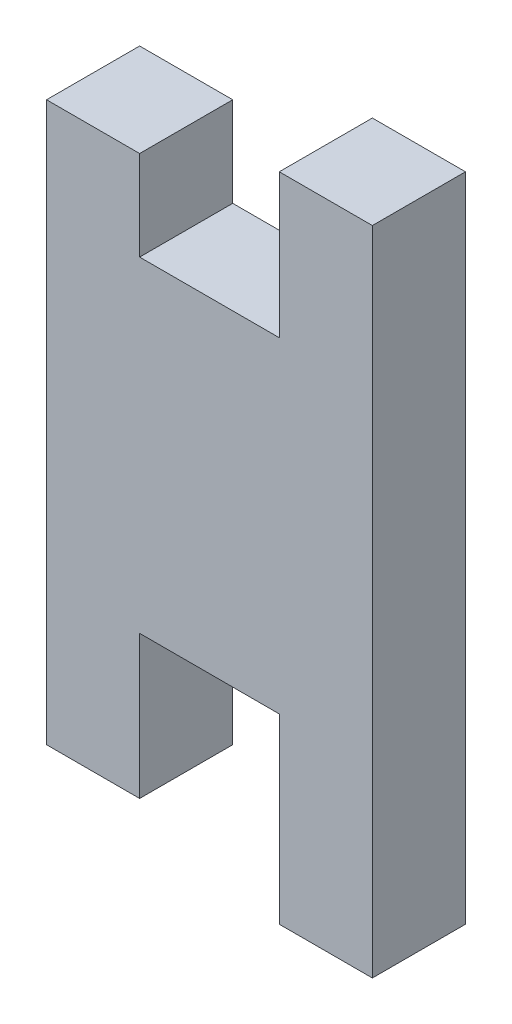
ISO-10303-21;
HEADER;
FILE_DESCRIPTION(('STEP AP214'),'2;1');
FILE_NAME('part.step','',(''),(''),'','','');
FILE_SCHEMA(('AUTOMOTIVE_DESIGN { 1 0 10303 214 1 1 1 1 }'));
ENDSEC;
DATA;
#1=APPLICATION_CONTEXT('core data for automotive mechanical design processes');
#2=APPLICATION_PROTOCOL_DEFINITION('international standard','automotive_design',2000,#1);
#3=PRODUCT_CONTEXT('',#1,'mechanical');
#4=PRODUCT('Part','Part','',(#3));
#5=PRODUCT_RELATED_PRODUCT_CATEGORY('part','',(#4));
#6=PRODUCT_DEFINITION_FORMATION('','',#4);
#7=PRODUCT_DEFINITION_CONTEXT('part definition',#1,'design');
#8=PRODUCT_DEFINITION('design','',#6,#7);
#9=PRODUCT_DEFINITION_SHAPE('','',#8);
#10=(LENGTH_UNIT() NAMED_UNIT(*) SI_UNIT(.MILLI.,.METRE.));
#11=(NAMED_UNIT(*) PLANE_ANGLE_UNIT() SI_UNIT($,.RADIAN.));
#12=(NAMED_UNIT(*) SI_UNIT($,.STERADIAN.) SOLID_ANGLE_UNIT());
#13=UNCERTAINTY_MEASURE_WITH_UNIT(LENGTH_MEASURE(1.E-05),#10,'distance_accuracy_value','');
#14=(GEOMETRIC_REPRESENTATION_CONTEXT(3) GLOBAL_UNCERTAINTY_ASSIGNED_CONTEXT((#13)) GLOBAL_UNIT_ASSIGNED_CONTEXT((#10,
#11,#12)) REPRESENTATION_CONTEXT('',''));
#15=CARTESIAN_POINT('',(0.,0.,0.));
#16=DIRECTION('',(0.,0.,1.));
#17=DIRECTION('',(1.,0.,0.));
#18=AXIS2_PLACEMENT_3D('',#15,#16,#17);
#19=CARTESIAN_POINT('',(0.,-60.,-10.));
#20=DIRECTION('',(-1.,0.,0.));
#21=DIRECTION('',(0.,0.,1.));
#22=AXIS2_PLACEMENT_3D('',#19,#20,#21);
#23=PLANE('',#22);
#24=DIRECTION('',(0.,-1.,0.));
#25=VECTOR('',#24,1.);
#26=CARTESIAN_POINT('',(0.,-60.,0.));
#27=LINE('',#26,#25);
#28=CARTESIAN_POINT('',(0.,0.,0.));
#29=VERTEX_POINT('',#28);
#30=CARTESIAN_POINT('',(0.,-60.,0.));
#31=VERTEX_POINT('',#30);
#32=EDGE_CURVE('E158',#29,#31,#27,.T.);
#33=ORIENTED_EDGE('',*,*,#32,.F.);
#34=DIRECTION('',(0.,0.,1.));
#35=VECTOR('',#34,1.);
#36=CARTESIAN_POINT('',(0.,0.,-10.));
#37=LINE('',#36,#35);
#38=CARTESIAN_POINT('',(0.,0.,-10.));
#39=VERTEX_POINT('',#38);
#40=EDGE_CURVE('E11',#39,#29,#37,.T.);
#41=ORIENTED_EDGE('',*,*,#40,.F.);
#42=DIRECTION('',(0.,-1.,0.));
#43=VECTOR('',#42,1.);
#44=CARTESIAN_POINT('',(0.,-60.,-10.));
#45=LINE('',#44,#43);
#46=CARTESIAN_POINT('',(0.,-60.,-10.));
#47=VERTEX_POINT('',#46);
#48=EDGE_CURVE('E190',#39,#47,#45,.T.);
#49=ORIENTED_EDGE('',*,*,#48,.T.);
#50=DIRECTION('',(0.,0.,1.));
#51=VECTOR('',#50,1.);
#52=CARTESIAN_POINT('',(0.,-60.,-10.));
#53=LINE('',#52,#51);
#54=EDGE_CURVE('E40',#47,#31,#53,.T.);
#55=ORIENTED_EDGE('',*,*,#54,.T.);
#56=EDGE_LOOP('',(#33,#41,#49,#55));
#57=FACE_BOUND('',#56,.T.);
#58=ADVANCED_FACE('F37',(#57),#23,.T.);
#59=CARTESIAN_POINT('',(0.,0.,-10.));
#60=DIRECTION('',(0.,1.,0.));
#61=DIRECTION('',(0.,0.,1.));
#62=AXIS2_PLACEMENT_3D('',#59,#60,#61);
#63=PLANE('',#62);
#64=DIRECTION('',(-1.,0.,0.));
#65=VECTOR('',#64,1.);
#66=CARTESIAN_POINT('',(0.,0.,0.));
#67=LINE('',#66,#65);
#68=CARTESIAN_POINT('',(10.,0.,0.));
#69=VERTEX_POINT('',#68);
#70=EDGE_CURVE('E188',#69,#29,#67,.T.);
#71=ORIENTED_EDGE('',*,*,#70,.F.);
#72=DIRECTION('',(0.,0.,1.));
#73=VECTOR('',#72,1.);
#74=CARTESIAN_POINT('',(10.,0.,-10.));
#75=LINE('',#74,#73);
#76=CARTESIAN_POINT('',(10.,0.,-10.));
#77=VERTEX_POINT('',#76);
#78=EDGE_CURVE('E46',#77,#69,#75,.T.);
#79=ORIENTED_EDGE('',*,*,#78,.F.);
#80=DIRECTION('',(-1.,0.,0.));
#81=VECTOR('',#80,1.);
#82=CARTESIAN_POINT('',(0.,0.,-10.));
#83=LINE('',#82,#81);
#84=EDGE_CURVE('E148',#77,#39,#83,.T.);
#85=ORIENTED_EDGE('',*,*,#84,.T.);
#86=ORIENTED_EDGE('',*,*,#40,.T.);
#87=EDGE_LOOP('',(#71,#79,#85,#86));
#88=FACE_BOUND('',#87,.T.);
#89=ADVANCED_FACE('F210',(#88),#63,.T.);
#90=CARTESIAN_POINT('',(10.,0.,-10.));
#91=DIRECTION('',(1.,0.,0.));
#92=DIRECTION('',(0.,0.,-1.));
#93=AXIS2_PLACEMENT_3D('',#90,#91,#92);
#94=PLANE('',#93);
#95=DIRECTION('',(0.,1.,0.));
#96=VECTOR('',#95,1.);
#97=CARTESIAN_POINT('',(10.,0.,0.));
#98=LINE('',#97,#96);
#99=CARTESIAN_POINT('',(10.,-9.63667820069206,0.));
#100=VERTEX_POINT('',#99);
#101=EDGE_CURVE('E135',#100,#69,#98,.T.);
#102=ORIENTED_EDGE('',*,*,#101,.F.);
#103=DIRECTION('',(0.,0.,1.));
#104=VECTOR('',#103,1.);
#105=CARTESIAN_POINT('',(10.,-9.63667820069206,-10.));
#106=LINE('',#105,#104);
#107=CARTESIAN_POINT('',(10.,-9.63667820069206,-10.));
#108=VERTEX_POINT('',#107);
#109=EDGE_CURVE('E130',#108,#100,#106,.T.);
#110=ORIENTED_EDGE('',*,*,#109,.F.);
#111=DIRECTION('',(0.,1.,0.));
#112=VECTOR('',#111,1.);
#113=CARTESIAN_POINT('',(10.,0.,-10.));
#114=LINE('',#113,#112);
#115=EDGE_CURVE('E133',#108,#77,#114,.T.);
#116=ORIENTED_EDGE('',*,*,#115,.T.);
#117=ORIENTED_EDGE('',*,*,#78,.T.);
#118=EDGE_LOOP('',(#102,#110,#116,#117));
#119=FACE_BOUND('',#118,.T.);
#120=ADVANCED_FACE('F132',(#119),#94,.T.);
#121=CARTESIAN_POINT('',(10.,-9.63667820069206,-10.));
#122=DIRECTION('',(0.,1.,0.));
#123=DIRECTION('',(-1.,0.,0.));
#124=AXIS2_PLACEMENT_3D('',#121,#122,#123);
#125=PLANE('',#124);
#126=DIRECTION('',(-1.,0.,0.));
#127=VECTOR('',#126,1.);
#128=CARTESIAN_POINT('',(10.,-9.63667820069206,0.));
#129=LINE('',#128,#127);
#130=CARTESIAN_POINT('',(25.,-9.63667820069206,0.));
#131=VERTEX_POINT('',#130);
#132=EDGE_CURVE('E185',#131,#100,#129,.T.);
#133=ORIENTED_EDGE('',*,*,#132,.F.);
#134=DIRECTION('',(0.,0.,1.));
#135=VECTOR('',#134,1.);
#136=CARTESIAN_POINT('',(25.,-9.63667820069206,-10.));
#137=LINE('',#136,#135);
#138=CARTESIAN_POINT('',(25.,-9.63667820069206,-10.));
#139=VERTEX_POINT('',#138);
#140=EDGE_CURVE('E140',#139,#131,#137,.T.);
#141=ORIENTED_EDGE('',*,*,#140,.F.);
#142=DIRECTION('',(-1.,0.,0.));
#143=VECTOR('',#142,1.);
#144=CARTESIAN_POINT('',(10.,-9.63667820069206,-10.));
#145=LINE('',#144,#143);
#146=EDGE_CURVE('E146',#139,#108,#145,.T.);
#147=ORIENTED_EDGE('',*,*,#146,.T.);
#148=ORIENTED_EDGE('',*,*,#109,.T.);
#149=EDGE_LOOP('',(#133,#141,#147,#148));
#150=FACE_BOUND('',#149,.T.);
#151=ADVANCED_FACE('F150',(#150),#125,.T.);
#152=CARTESIAN_POINT('',(25.,-9.63667820069206,-10.));
#153=DIRECTION('',(-1.,0.,0.));
#154=DIRECTION('',(0.,0.,1.));
#155=AXIS2_PLACEMENT_3D('',#152,#153,#154);
#156=PLANE('',#155);
#157=DIRECTION('',(0.,-1.,0.));
#158=VECTOR('',#157,1.);
#159=CARTESIAN_POINT('',(25.,-9.63667820069206,0.));
#160=LINE('',#159,#158);
#161=CARTESIAN_POINT('',(25.,5.79984424667594,0.));
#162=VERTEX_POINT('',#161);
#163=EDGE_CURVE('E182',#162,#131,#160,.T.);
#164=ORIENTED_EDGE('',*,*,#163,.F.);
#165=DIRECTION('',(0.,0.,1.));
#166=VECTOR('',#165,1.);
#167=CARTESIAN_POINT('',(25.,5.79984424667594,-10.));
#168=LINE('',#167,#166);
#169=CARTESIAN_POINT('',(25.,5.79984424667594,-10.));
#170=VERTEX_POINT('',#169);
#171=EDGE_CURVE('E194',#170,#162,#168,.T.);
#172=ORIENTED_EDGE('',*,*,#171,.F.);
#173=DIRECTION('',(0.,-1.,0.));
#174=VECTOR('',#173,1.);
#175=CARTESIAN_POINT('',(25.,-9.63667820069206,-10.));
#176=LINE('',#175,#174);
#177=EDGE_CURVE('E151',#170,#139,#176,.T.);
#178=ORIENTED_EDGE('',*,*,#177,.T.);
#179=ORIENTED_EDGE('',*,*,#140,.T.);
#180=EDGE_LOOP('',(#164,#172,#178,#179));
#181=FACE_BOUND('',#180,.T.);
#182=ADVANCED_FACE('F223',(#181),#156,.T.);
#183=CARTESIAN_POINT('',(25.,5.79984424667594,-10.));
#184=DIRECTION('',(0.,1.,0.));
#185=DIRECTION('',(0.,0.,1.));
#186=AXIS2_PLACEMENT_3D('',#183,#184,#185);
#187=PLANE('',#186);
#188=DIRECTION('',(-1.,0.,0.));
#189=VECTOR('',#188,1.);
#190=CARTESIAN_POINT('',(25.,5.79984424667594,0.));
#191=LINE('',#190,#189);
#192=CARTESIAN_POINT('',(35.,5.79984424667594,0.));
#193=VERTEX_POINT('',#192);
#194=EDGE_CURVE('E179',#193,#162,#191,.T.);
#195=ORIENTED_EDGE('',*,*,#194,.F.);
#196=DIRECTION('',(0.,0.,1.));
#197=VECTOR('',#196,1.);
#198=CARTESIAN_POINT('',(35.,5.79984424667594,-10.));
#199=LINE('',#198,#197);
#200=CARTESIAN_POINT('',(35.,5.79984424667594,-10.));
#201=VERTEX_POINT('',#200);
#202=EDGE_CURVE('E196',#201,#193,#199,.T.);
#203=ORIENTED_EDGE('',*,*,#202,.F.);
#204=DIRECTION('',(-1.,0.,0.));
#205=VECTOR('',#204,1.);
#206=CARTESIAN_POINT('',(25.,5.79984424667594,-10.));
#207=LINE('',#206,#205);
#208=EDGE_CURVE('E153',#201,#170,#207,.T.);
#209=ORIENTED_EDGE('',*,*,#208,.T.);
#210=ORIENTED_EDGE('',*,*,#171,.T.);
#211=EDGE_LOOP('',(#195,#203,#209,#210));
#212=FACE_BOUND('',#211,.T.);
#213=ADVANCED_FACE('F226',(#212),#187,.T.);
#214=CARTESIAN_POINT('',(35.,5.79984424667594,-10.));
#215=DIRECTION('',(1.,0.,0.));
#216=DIRECTION('',(0.,1.,0.));
#217=AXIS2_PLACEMENT_3D('',#214,#215,#216);
#218=PLANE('',#217);
#219=DIRECTION('',(0.,1.,0.));
#220=VECTOR('',#219,1.);
#221=CARTESIAN_POINT('',(35.,5.79984424667594,0.));
#222=LINE('',#221,#220);
#223=CARTESIAN_POINT('',(35.,-64.2001557533241,0.));
#224=VERTEX_POINT('',#223);
#225=EDGE_CURVE('E176',#224,#193,#222,.T.);
#226=ORIENTED_EDGE('',*,*,#225,.F.);
#227=DIRECTION('',(0.,0.,1.));
#228=VECTOR('',#227,1.);
#229=CARTESIAN_POINT('',(35.,-64.2001557533241,-10.));
#230=LINE('',#229,#228);
#231=CARTESIAN_POINT('',(35.,-64.2001557533241,-10.));
#232=VERTEX_POINT('',#231);
#233=EDGE_CURVE('E198',#232,#224,#230,.T.);
#234=ORIENTED_EDGE('',*,*,#233,.F.);
#235=DIRECTION('',(0.,1.,0.));
#236=VECTOR('',#235,1.);
#237=CARTESIAN_POINT('',(35.,5.79984424667594,-10.));
#238=LINE('',#237,#236);
#239=EDGE_CURVE('E380',#232,#201,#238,.T.);
#240=ORIENTED_EDGE('',*,*,#239,.T.);
#241=ORIENTED_EDGE('',*,*,#202,.T.);
#242=EDGE_LOOP('',(#226,#234,#240,#241));
#243=FACE_BOUND('',#242,.T.);
#244=ADVANCED_FACE('F230',(#243),#218,.T.);
#245=CARTESIAN_POINT('',(35.,-64.2001557533241,-10.));
#246=DIRECTION('',(0.,-1.,0.));
#247=DIRECTION('',(0.,0.,-1.));
#248=AXIS2_PLACEMENT_3D('',#245,#246,#247);
#249=PLANE('',#248);
#250=DIRECTION('',(1.,0.,0.));
#251=VECTOR('',#250,1.);
#252=CARTESIAN_POINT('',(35.,-64.2001557533241,0.));
#253=LINE('',#252,#251);
#254=CARTESIAN_POINT('',(25.,-64.2001557533241,0.));
#255=VERTEX_POINT('',#254);
#256=EDGE_CURVE('E173',#255,#224,#253,.T.);
#257=ORIENTED_EDGE('',*,*,#256,.F.);
#258=DIRECTION('',(0.,0.,1.));
#259=VECTOR('',#258,1.);
#260=CARTESIAN_POINT('',(25.,-64.2001557533241,-10.));
#261=LINE('',#260,#259);
#262=CARTESIAN_POINT('',(25.,-64.2001557533241,-10.));
#263=VERTEX_POINT('',#262);
#264=EDGE_CURVE('E200',#263,#255,#261,.T.);
#265=ORIENTED_EDGE('',*,*,#264,.F.);
#266=DIRECTION('',(1.,0.,0.));
#267=VECTOR('',#266,1.);
#268=CARTESIAN_POINT('',(35.,-64.2001557533241,-10.));
#269=LINE('',#268,#267);
#270=EDGE_CURVE('E384',#263,#232,#269,.T.);
#271=ORIENTED_EDGE('',*,*,#270,.T.);
#272=ORIENTED_EDGE('',*,*,#233,.T.);
#273=EDGE_LOOP('',(#257,#265,#271,#272));
#274=FACE_BOUND('',#273,.T.);
#275=ADVANCED_FACE('F234',(#274),#249,.T.);
#276=CARTESIAN_POINT('',(25.,-64.2001557533241,-10.));
#277=DIRECTION('',(-1.,0.,0.));
#278=DIRECTION('',(0.,-1.,0.));
#279=AXIS2_PLACEMENT_3D('',#276,#277,#278);
#280=PLANE('',#279);
#281=DIRECTION('',(0.,-1.,0.));
#282=VECTOR('',#281,1.);
#283=CARTESIAN_POINT('',(25.,-64.2001557533241,0.));
#284=LINE('',#283,#282);
#285=CARTESIAN_POINT('',(25.,-44.6366782006921,0.));
#286=VERTEX_POINT('',#285);
#287=EDGE_CURVE('E170',#286,#255,#284,.T.);
#288=ORIENTED_EDGE('',*,*,#287,.F.);
#289=DIRECTION('',(0.,0.,1.));
#290=VECTOR('',#289,1.);
#291=CARTESIAN_POINT('',(25.,-44.6366782006921,-10.));
#292=LINE('',#291,#290);
#293=CARTESIAN_POINT('',(25.,-44.6366782006921,-10.));
#294=VERTEX_POINT('',#293);
#295=EDGE_CURVE('E202',#294,#286,#292,.T.);
#296=ORIENTED_EDGE('',*,*,#295,.F.);
#297=DIRECTION('',(0.,-1.,0.));
#298=VECTOR('',#297,1.);
#299=CARTESIAN_POINT('',(25.,-64.2001557533241,-10.));
#300=LINE('',#299,#298);
#301=EDGE_CURVE('E373',#294,#263,#300,.T.);
#302=ORIENTED_EDGE('',*,*,#301,.T.);
#303=ORIENTED_EDGE('',*,*,#264,.T.);
#304=EDGE_LOOP('',(#288,#296,#302,#303));
#305=FACE_BOUND('',#304,.T.);
#306=ADVANCED_FACE('F238',(#305),#280,.T.);
#307=CARTESIAN_POINT('',(25.,-44.6366782006921,-10.));
#308=DIRECTION('',(0.,-1.,0.));
#309=DIRECTION('',(0.,0.,-1.));
#310=AXIS2_PLACEMENT_3D('',#307,#308,#309);
#311=PLANE('',#310);
#312=DIRECTION('',(1.,0.,0.));
#313=VECTOR('',#312,1.);
#314=CARTESIAN_POINT('',(25.,-44.6366782006921,0.));
#315=LINE('',#314,#313);
#316=CARTESIAN_POINT('',(10.,-44.6366782006921,0.));
#317=VERTEX_POINT('',#316);
#318=EDGE_CURVE('E167',#317,#286,#315,.T.);
#319=ORIENTED_EDGE('',*,*,#318,.F.);
#320=DIRECTION('',(0.,0.,1.));
#321=VECTOR('',#320,1.);
#322=CARTESIAN_POINT('',(10.,-44.6366782006921,-10.));
#323=LINE('',#322,#321);
#324=CARTESIAN_POINT('',(10.,-44.6366782006921,-10.));
#325=VERTEX_POINT('',#324);
#326=EDGE_CURVE('E204',#325,#317,#323,.T.);
#327=ORIENTED_EDGE('',*,*,#326,.F.);
#328=DIRECTION('',(1.,0.,0.));
#329=VECTOR('',#328,1.);
#330=CARTESIAN_POINT('',(25.,-44.6366782006921,-10.));
#331=LINE('',#330,#329);
#332=EDGE_CURVE('E369',#325,#294,#331,.T.);
#333=ORIENTED_EDGE('',*,*,#332,.T.);
#334=ORIENTED_EDGE('',*,*,#295,.T.);
#335=EDGE_LOOP('',(#319,#327,#333,#334));
#336=FACE_BOUND('',#335,.T.);
#337=ADVANCED_FACE('F242',(#336),#311,.T.);
#338=CARTESIAN_POINT('',(10.,-44.6366782006921,-10.));
#339=DIRECTION('',(1.,0.,0.));
#340=DIRECTION('',(0.,1.,0.));
#341=AXIS2_PLACEMENT_3D('',#338,#339,#340);
#342=PLANE('',#341);
#343=DIRECTION('',(0.,1.,0.));
#344=VECTOR('',#343,1.);
#345=CARTESIAN_POINT('',(10.,-44.6366782006921,0.));
#346=LINE('',#345,#344);
#347=CARTESIAN_POINT('',(10.,-60.,0.));
#348=VERTEX_POINT('',#347);
#349=EDGE_CURVE('E164',#348,#317,#346,.T.);
#350=ORIENTED_EDGE('',*,*,#349,.F.);
#351=DIRECTION('',(0.,0.,1.));
#352=VECTOR('',#351,1.);
#353=CARTESIAN_POINT('',(10.,-60.,-10.));
#354=LINE('',#353,#352);
#355=CARTESIAN_POINT('',(10.,-60.,-10.));
#356=VERTEX_POINT('',#355);
#357=EDGE_CURVE('E205',#356,#348,#354,.T.);
#358=ORIENTED_EDGE('',*,*,#357,.F.);
#359=DIRECTION('',(0.,1.,0.));
#360=VECTOR('',#359,1.);
#361=CARTESIAN_POINT('',(10.,-44.6366782006921,-10.));
#362=LINE('',#361,#360);
#363=EDGE_CURVE('E390',#356,#325,#362,.T.);
#364=ORIENTED_EDGE('',*,*,#363,.T.);
#365=ORIENTED_EDGE('',*,*,#326,.T.);
#366=EDGE_LOOP('',(#350,#358,#364,#365));
#367=FACE_BOUND('',#366,.T.);
#368=ADVANCED_FACE('F246',(#367),#342,.T.);
#369=CARTESIAN_POINT('',(10.,-60.,-10.));
#370=DIRECTION('',(0.,-1.,0.));
#371=DIRECTION('',(0.,0.,-1.));
#372=AXIS2_PLACEMENT_3D('',#369,#370,#371);
#373=PLANE('',#372);
#374=DIRECTION('',(1.,0.,0.));
#375=VECTOR('',#374,1.);
#376=CARTESIAN_POINT('',(10.,-60.,0.));
#377=LINE('',#376,#375);
#378=EDGE_CURVE('E161',#31,#348,#377,.T.);
#379=ORIENTED_EDGE('',*,*,#378,.F.);
#380=ORIENTED_EDGE('',*,*,#54,.F.);
#381=DIRECTION('',(1.,0.,0.));
#382=VECTOR('',#381,1.);
#383=CARTESIAN_POINT('',(10.,-60.,-10.));
#384=LINE('',#383,#382);
#385=EDGE_CURVE('E392',#47,#356,#384,.T.);
#386=ORIENTED_EDGE('',*,*,#385,.T.);
#387=ORIENTED_EDGE('',*,*,#357,.T.);
#388=EDGE_LOOP('',(#379,#380,#386,#387));
#389=FACE_BOUND('',#388,.T.);
#390=ADVANCED_FACE('F207',(#389),#373,.T.);
#391=CARTESIAN_POINT('',(0.,0.,-10.));
#392=DIRECTION('',(0.,0.,-1.));
#393=DIRECTION('',(-1.,0.,0.));
#394=AXIS2_PLACEMENT_3D('',#391,#392,#393);
#395=PLANE('',#394);
#396=ORIENTED_EDGE('',*,*,#48,.F.);
#397=ORIENTED_EDGE('',*,*,#84,.F.);
#398=ORIENTED_EDGE('',*,*,#115,.F.);
#399=ORIENTED_EDGE('',*,*,#146,.F.);
#400=ORIENTED_EDGE('',*,*,#177,.F.);
#401=ORIENTED_EDGE('',*,*,#208,.F.);
#402=ORIENTED_EDGE('',*,*,#239,.F.);
#403=ORIENTED_EDGE('',*,*,#270,.F.);
#404=ORIENTED_EDGE('',*,*,#301,.F.);
#405=ORIENTED_EDGE('',*,*,#332,.F.);
#406=ORIENTED_EDGE('',*,*,#363,.F.);
#407=ORIENTED_EDGE('',*,*,#385,.F.);
#408=EDGE_LOOP('',(#396,#397,#398,#399,#400,#401,#402,#403,#404,#405,#406,#407));
#409=FACE_BOUND('',#408,.T.);
#410=ADVANCED_FACE('F144',(#409),#395,.T.);
#411=CARTESIAN_POINT('',(0.,0.,0.));
#412=DIRECTION('',(0.,0.,-1.));
#413=DIRECTION('',(-1.,0.,0.));
#414=AXIS2_PLACEMENT_3D('',#411,#412,#413);
#415=PLANE('',#414);
#416=ORIENTED_EDGE('',*,*,#32,.T.);
#417=ORIENTED_EDGE('',*,*,#378,.T.);
#418=ORIENTED_EDGE('',*,*,#349,.T.);
#419=ORIENTED_EDGE('',*,*,#318,.T.);
#420=ORIENTED_EDGE('',*,*,#287,.T.);
#421=ORIENTED_EDGE('',*,*,#256,.T.);
#422=ORIENTED_EDGE('',*,*,#225,.T.);
#423=ORIENTED_EDGE('',*,*,#194,.T.);
#424=ORIENTED_EDGE('',*,*,#163,.T.);
#425=ORIENTED_EDGE('',*,*,#132,.T.);
#426=ORIENTED_EDGE('',*,*,#101,.T.);
#427=ORIENTED_EDGE('',*,*,#70,.T.);
#428=EDGE_LOOP('',(#416,#417,#418,#419,#420,#421,#422,#423,#424,#425,#426,#427));
#429=FACE_BOUND('',#428,.T.);
#430=ADVANCED_FACE('F209',(#429),#415,.F.);
#431=CLOSED_SHELL('',(#58,#89,#120,#151,#182,#213,#244,#275,#306,#337,#368,#390,#410,#430));
#432=MANIFOLD_SOLID_BREP('B2',#431);
#433=ADVANCED_BREP_SHAPE_REPRESENTATION('',(#18,#432),#14);
#434=SHAPE_DEFINITION_REPRESENTATION(#9,#433);
ENDSEC;
END-ISO-10303-21;
